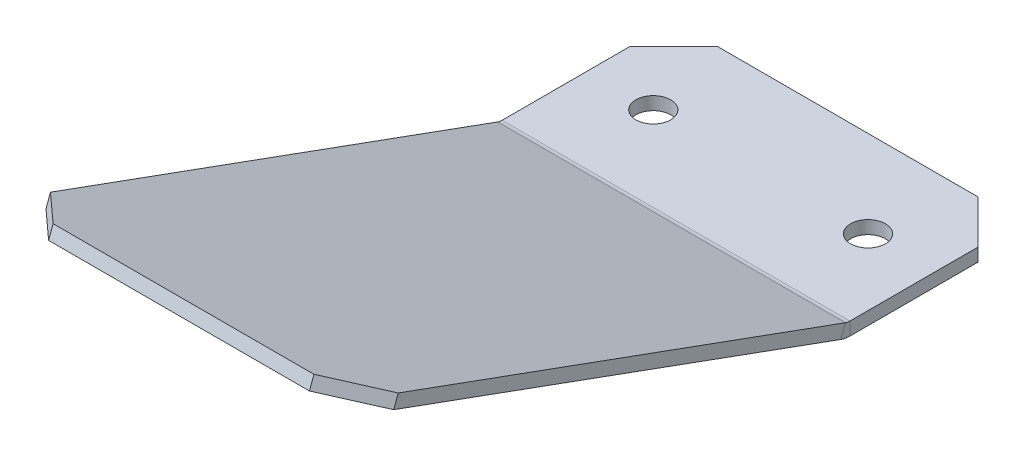
ISO-10303-21;
HEADER;
FILE_DESCRIPTION(('STEP AP214'),'2;1');
FILE_NAME('part.step','',(''),(''),'','','');
FILE_SCHEMA(('AUTOMOTIVE_DESIGN { 1 0 10303 214 1 1 1 1 }'));
ENDSEC;
DATA;
#1=APPLICATION_CONTEXT('core data for automotive mechanical design processes');
#2=APPLICATION_PROTOCOL_DEFINITION('international standard','automotive_design',2000,#1);
#3=PRODUCT_CONTEXT('',#1,'mechanical');
#4=PRODUCT('Part','Part','',(#3));
#5=PRODUCT_RELATED_PRODUCT_CATEGORY('part','',(#4));
#6=PRODUCT_DEFINITION_FORMATION('','',#4);
#7=PRODUCT_DEFINITION_CONTEXT('part definition',#1,'design');
#8=PRODUCT_DEFINITION('design','',#6,#7);
#9=PRODUCT_DEFINITION_SHAPE('','',#8);
#10=(LENGTH_UNIT() NAMED_UNIT(*) SI_UNIT(.MILLI.,.METRE.));
#11=(NAMED_UNIT(*) PLANE_ANGLE_UNIT() SI_UNIT($,.RADIAN.));
#12=(NAMED_UNIT(*) SI_UNIT($,.STERADIAN.) SOLID_ANGLE_UNIT());
#13=UNCERTAINTY_MEASURE_WITH_UNIT(LENGTH_MEASURE(1.E-05),#10,'distance_accuracy_value','');
#14=(GEOMETRIC_REPRESENTATION_CONTEXT(3) GLOBAL_UNCERTAINTY_ASSIGNED_CONTEXT((#13)) GLOBAL_UNIT_ASSIGNED_CONTEXT((#10,
#11,#12)) REPRESENTATION_CONTEXT('',''));
#15=CARTESIAN_POINT('',(0.,0.,0.));
#16=DIRECTION('',(0.,0.,1.));
#17=DIRECTION('',(1.,0.,0.));
#18=AXIS2_PLACEMENT_3D('',#15,#16,#17);
#19=CARTESIAN_POINT('',(20.,-1.5,-10.));
#20=DIRECTION('',(1.,0.,0.));
#21=DIRECTION('',(0.,0.,-1.));
#22=AXIS2_PLACEMENT_3D('',#19,#20,#21);
#23=PLANE('',#22);
#24=DIRECTION('',(0.,0.,-1.));
#25=VECTOR('',#24,1.);
#26=CARTESIAN_POINT('',(20.,-1.5,-10.));
#27=LINE('',#26,#25);
#28=CARTESIAN_POINT('',(20.,-1.5,9.73550952893731));
#29=VERTEX_POINT('',#28);
#30=CARTESIAN_POINT('',(20.,-1.5,-5.));
#31=VERTEX_POINT('',#30);
#32=EDGE_CURVE('E207',#29,#31,#27,.T.);
#33=ORIENTED_EDGE('',*,*,#32,.T.);
#34=DIRECTION('',(0.,1.,0.));
#35=VECTOR('',#34,1.);
#36=CARTESIAN_POINT('',(20.,-1.5,-4.99999999999999));
#37=LINE('',#36,#35);
#38=CARTESIAN_POINT('',(20.,0.,-5.));
#39=VERTEX_POINT('',#38);
#40=EDGE_CURVE('E238',#31,#39,#37,.T.);
#41=ORIENTED_EDGE('',*,*,#40,.T.);
#42=DIRECTION('',(0.,0.,-1.));
#43=VECTOR('',#42,1.);
#44=CARTESIAN_POINT('',(20.,0.,-10.));
#45=LINE('',#44,#43);
#46=CARTESIAN_POINT('',(20.,0.,9.73550952893731));
#47=VERTEX_POINT('',#46);
#48=EDGE_CURVE('E206',#47,#39,#45,.T.);
#49=ORIENTED_EDGE('',*,*,#48,.F.);
#50=DIRECTION('',(0.,-1.,0.));
#51=VECTOR('',#50,1.);
#52=CARTESIAN_POINT('',(20.,0.,9.73550952893731));
#53=LINE('',#52,#51);
#54=EDGE_CURVE('E181',#47,#29,#53,.T.);
#55=ORIENTED_EDGE('',*,*,#54,.T.);
#56=EDGE_LOOP('',(#33,#41,#49,#55));
#57=FACE_BOUND('',#56,.T.);
#58=ADVANCED_FACE('F39',(#57),#23,.T.);
#59=CARTESIAN_POINT('',(0.,-1.5,0.));
#60=DIRECTION('',(0.,1.,0.));
#61=DIRECTION('',(0.,0.,1.));
#62=AXIS2_PLACEMENT_3D('',#59,#60,#61);
#63=PLANE('',#62);
#64=CARTESIAN_POINT('',(-12.3492795753286,-1.5,0.));
#65=DIRECTION('',(0.,1.,0.));
#66=DIRECTION('',(0.,0.,1.));
#67=AXIS2_PLACEMENT_3D('',#64,#65,#66);
#68=CIRCLE('',#67,2.);
#69=CARTESIAN_POINT('',(-12.3492795753286,-1.5,2.));
#70=VERTEX_POINT('',#69);
#71=EDGE_CURVE('E203',#70,#70,#68,.T.);
#72=ORIENTED_EDGE('',*,*,#71,.T.);
#73=EDGE_LOOP('',(#72));
#74=FACE_BOUND('',#73,.T.);
#75=CARTESIAN_POINT('',(12.3492795753286,-1.5,0.));
#76=DIRECTION('',(0.,1.,0.));
#77=DIRECTION('',(0.,0.,1.));
#78=AXIS2_PLACEMENT_3D('',#75,#76,#77);
#79=CIRCLE('',#78,2.);
#80=CARTESIAN_POINT('',(12.3492795753286,-1.5,2.00000000000001));
#81=VERTEX_POINT('',#80);
#82=EDGE_CURVE('E197',#81,#81,#79,.T.);
#83=ORIENTED_EDGE('',*,*,#82,.T.);
#84=EDGE_LOOP('',(#83));
#85=FACE_BOUND('',#84,.T.);
#86=DIRECTION('',(-1.,0.,0.));
#87=VECTOR('',#86,1.);
#88=CARTESIAN_POINT('',(-20.,-1.5,-10.));
#89=LINE('',#88,#87);
#90=CARTESIAN_POINT('',(15.,-1.5,-10.));
#91=VERTEX_POINT('',#90);
#92=CARTESIAN_POINT('',(-15.,-1.5,-10.));
#93=VERTEX_POINT('',#92);
#94=EDGE_CURVE('E210',#91,#93,#89,.T.);
#95=ORIENTED_EDGE('',*,*,#94,.F.);
#96=DIRECTION('',(-0.707106781186549,0.,-0.707106781186547));
#97=VECTOR('',#96,1.);
#98=CARTESIAN_POINT('',(20.,-1.5,-4.99999999999999));
#99=LINE('',#98,#97);
#100=EDGE_CURVE('E47',#91,#31,#99,.F.);
#101=ORIENTED_EDGE('',*,*,#100,.T.);
#102=ORIENTED_EDGE('',*,*,#32,.F.);
#103=DIRECTION('',(1.,0.,0.));
#104=VECTOR('',#103,1.);
#105=CARTESIAN_POINT('',(20.,-1.5,9.73550952893731));
#106=LINE('',#105,#104);
#107=CARTESIAN_POINT('',(-20.,-1.5,9.73550952893731));
#108=VERTEX_POINT('',#107);
#109=EDGE_CURVE('E137',#29,#108,#106,.F.);
#110=ORIENTED_EDGE('',*,*,#109,.T.);
#111=DIRECTION('',(0.,0.,1.));
#112=VECTOR('',#111,1.);
#113=CARTESIAN_POINT('',(-20.,-1.5,-10.));
#114=LINE('',#113,#112);
#115=CARTESIAN_POINT('',(-20.,-1.5,-4.99999999999998));
#116=VERTEX_POINT('',#115);
#117=EDGE_CURVE('E213',#116,#108,#114,.T.);
#118=ORIENTED_EDGE('',*,*,#117,.F.);
#119=DIRECTION('',(-0.707106781186547,0.,0.707106781186548));
#120=VECTOR('',#119,1.);
#121=CARTESIAN_POINT('',(-15.,-1.5,-10.));
#122=LINE('',#121,#120);
#123=EDGE_CURVE('E59',#116,#93,#122,.F.);
#124=ORIENTED_EDGE('',*,*,#123,.T.);
#125=EDGE_LOOP('',(#95,#101,#102,#110,#118,#124));
#126=FACE_BOUND('',#125,.T.);
#127=ADVANCED_FACE('F251',(#74,#85,#126),#63,.F.);
#128=CARTESIAN_POINT('',(0.,0.,0.));
#129=DIRECTION('',(0.,1.,0.));
#130=DIRECTION('',(0.,0.,1.));
#131=AXIS2_PLACEMENT_3D('',#128,#129,#130);
#132=PLANE('',#131);
#133=CARTESIAN_POINT('',(-12.3492795753286,0.,0.));
#134=DIRECTION('',(0.,1.,0.));
#135=DIRECTION('',(0.,0.,1.));
#136=AXIS2_PLACEMENT_3D('',#133,#134,#135);
#137=CIRCLE('',#136,2.);
#138=CARTESIAN_POINT('',(-12.3492795753286,0.,2.));
#139=VERTEX_POINT('',#138);
#140=EDGE_CURVE('E200',#139,#139,#137,.T.);
#141=ORIENTED_EDGE('',*,*,#140,.F.);
#142=EDGE_LOOP('',(#141));
#143=FACE_BOUND('',#142,.T.);
#144=CARTESIAN_POINT('',(12.3492795753286,0.,0.));
#145=DIRECTION('',(0.,1.,0.));
#146=DIRECTION('',(0.,0.,-1.));
#147=AXIS2_PLACEMENT_3D('',#144,#145,#146);
#148=CIRCLE('',#147,2.);
#149=CARTESIAN_POINT('',(12.3492795753286,0.,-1.99999999999999));
#150=VERTEX_POINT('',#149);
#151=EDGE_CURVE('E192',#150,#150,#148,.T.);
#152=ORIENTED_EDGE('',*,*,#151,.F.);
#153=EDGE_LOOP('',(#152));
#154=FACE_BOUND('',#153,.T.);
#155=ORIENTED_EDGE('',*,*,#48,.T.);
#156=DIRECTION('',(0.707106781186549,0.,0.707106781186547));
#157=VECTOR('',#156,1.);
#158=CARTESIAN_POINT('',(12.5,0.,-12.5));
#159=LINE('',#158,#157);
#160=CARTESIAN_POINT('',(15.,0.,-10.));
#161=VERTEX_POINT('',#160);
#162=EDGE_CURVE('E243',#39,#161,#159,.F.);
#163=ORIENTED_EDGE('',*,*,#162,.T.);
#164=DIRECTION('',(-1.,0.,0.));
#165=VECTOR('',#164,1.);
#166=CARTESIAN_POINT('',(-20.,0.,-10.));
#167=LINE('',#166,#165);
#168=CARTESIAN_POINT('',(-15.,0.,-10.));
#169=VERTEX_POINT('',#168);
#170=EDGE_CURVE('E218',#161,#169,#167,.T.);
#171=ORIENTED_EDGE('',*,*,#170,.T.);
#172=DIRECTION('',(0.707106781186547,0.,-0.707106781186548));
#173=VECTOR('',#172,1.);
#174=CARTESIAN_POINT('',(-12.5,0.,-12.5));
#175=LINE('',#174,#173);
#176=CARTESIAN_POINT('',(-20.,0.,-4.99999999999998));
#177=VERTEX_POINT('',#176);
#178=EDGE_CURVE('E241',#169,#177,#175,.F.);
#179=ORIENTED_EDGE('',*,*,#178,.T.);
#180=DIRECTION('',(0.,0.,1.));
#181=VECTOR('',#180,1.);
#182=CARTESIAN_POINT('',(-20.,0.,-10.));
#183=LINE('',#182,#181);
#184=CARTESIAN_POINT('',(-20.,0.,9.73550952893731));
#185=VERTEX_POINT('',#184);
#186=EDGE_CURVE('E211',#177,#185,#183,.T.);
#187=ORIENTED_EDGE('',*,*,#186,.T.);
#188=DIRECTION('',(1.,0.,0.));
#189=VECTOR('',#188,1.);
#190=CARTESIAN_POINT('',(20.,0.,9.73550952893731));
#191=LINE('',#190,#189);
#192=EDGE_CURVE('E185',#47,#185,#191,.F.);
#193=ORIENTED_EDGE('',*,*,#192,.F.);
#194=EDGE_LOOP('',(#155,#163,#171,#179,#187,#193));
#195=FACE_BOUND('',#194,.T.);
#196=ADVANCED_FACE('F260',(#143,#154,#195),#132,.T.);
#197=CARTESIAN_POINT('',(-20.,-1.5,-10.));
#198=DIRECTION('',(-1.,0.,0.));
#199=DIRECTION('',(0.,0.,1.));
#200=AXIS2_PLACEMENT_3D('',#197,#198,#199);
#201=PLANE('',#200);
#202=ORIENTED_EDGE('',*,*,#186,.F.);
#203=DIRECTION('',(0.,-1.,0.));
#204=VECTOR('',#203,1.);
#205=CARTESIAN_POINT('',(-20.,-1.5,-4.99999999999998));
#206=LINE('',#205,#204);
#207=EDGE_CURVE('E11',#177,#116,#206,.T.);
#208=ORIENTED_EDGE('',*,*,#207,.T.);
#209=ORIENTED_EDGE('',*,*,#117,.T.);
#210=DIRECTION('',(0.,-1.,0.));
#211=VECTOR('',#210,1.);
#212=CARTESIAN_POINT('',(-20.,0.,9.73550952893731));
#213=LINE('',#212,#211);
#214=EDGE_CURVE('E189',#185,#108,#213,.T.);
#215=ORIENTED_EDGE('',*,*,#214,.F.);
#216=EDGE_LOOP('',(#202,#208,#209,#215));
#217=FACE_BOUND('',#216,.T.);
#218=ADVANCED_FACE('F266',(#217),#201,.T.);
#219=CARTESIAN_POINT('',(-20.,-1.5,-10.));
#220=DIRECTION('',(0.,0.,-1.));
#221=DIRECTION('',(-1.,0.,0.));
#222=AXIS2_PLACEMENT_3D('',#219,#220,#221);
#223=PLANE('',#222);
#224=ORIENTED_EDGE('',*,*,#170,.F.);
#225=DIRECTION('',(0.,-1.,0.));
#226=VECTOR('',#225,1.);
#227=CARTESIAN_POINT('',(15.,-1.5,-10.));
#228=LINE('',#227,#226);
#229=EDGE_CURVE('E248',#161,#91,#228,.T.);
#230=ORIENTED_EDGE('',*,*,#229,.T.);
#231=ORIENTED_EDGE('',*,*,#94,.T.);
#232=DIRECTION('',(0.,1.,0.));
#233=VECTOR('',#232,1.);
#234=CARTESIAN_POINT('',(-15.,-1.5,-10.));
#235=LINE('',#234,#233);
#236=EDGE_CURVE('E245',#93,#169,#235,.T.);
#237=ORIENTED_EDGE('',*,*,#236,.T.);
#238=EDGE_LOOP('',(#224,#230,#231,#237));
#239=FACE_BOUND('',#238,.T.);
#240=ADVANCED_FACE('F262',(#239),#223,.T.);
#241=CARTESIAN_POINT('',(-12.3492795753286,-10.,0.));
#242=DIRECTION('',(0.,1.,0.));
#243=DIRECTION('',(0.,0.,1.));
#244=AXIS2_PLACEMENT_3D('',#241,#242,#243);
#245=CYLINDRICAL_SURFACE('',#244,2.);
#246=ORIENTED_EDGE('',*,*,#140,.T.);
#247=EDGE_LOOP('',(#246));
#248=FACE_BOUND('',#247,.T.);
#249=ORIENTED_EDGE('',*,*,#71,.F.);
#250=EDGE_LOOP('',(#249));
#251=FACE_BOUND('',#250,.T.);
#252=ADVANCED_FACE('F385',(#248,#251),#245,.F.);
#253=CARTESIAN_POINT('',(12.3492795753286,-10.,0.));
#254=DIRECTION('',(0.,1.,0.));
#255=DIRECTION('',(0.,0.,1.));
#256=AXIS2_PLACEMENT_3D('',#253,#254,#255);
#257=CYLINDRICAL_SURFACE('',#256,2.);
#258=ORIENTED_EDGE('',*,*,#151,.T.);
#259=EDGE_LOOP('',(#258));
#260=FACE_BOUND('',#259,.T.);
#261=ORIENTED_EDGE('',*,*,#82,.F.);
#262=EDGE_LOOP('',(#261));
#263=FACE_BOUND('',#262,.T.);
#264=ADVANCED_FACE('F450',(#260,#263),#257,.F.);
#265=CARTESIAN_POINT('',(-20.,1.5,9.73550952893731));
#266=DIRECTION('',(-1.,0.,0.));
#267=DIRECTION('',(0.,0.,1.));
#268=AXIS2_PLACEMENT_3D('',#265,#266,#267);
#269=PLANE('',#268);
#270=DIRECTION('',(0.,-0.93969262078591,0.342020143325663));
#271=VECTOR('',#270,1.);
#272=CARTESIAN_POINT('',(-20.,0.0904610688211346,10.2485397439258));
#273=LINE('',#272,#271);
#274=CARTESIAN_POINT('',(-20.,0.0904610688211339,10.2485397439258));
#275=VERTEX_POINT('',#274);
#276=CARTESIAN_POINT('',(-20.,-1.31907786235773,10.7615699589143));
#277=VERTEX_POINT('',#276);
#278=EDGE_CURVE('E275',#275,#277,#273,.T.);
#279=ORIENTED_EDGE('',*,*,#278,.F.);
#280=CARTESIAN_POINT('',(-20.,1.5,9.73550952893731));
#281=DIRECTION('',(1.,0.,0.));
#282=DIRECTION('',(0.,0.,-1.));
#283=AXIS2_PLACEMENT_3D('',#280,#281,#282);
#284=CIRCLE('',#283,1.5);
#285=EDGE_CURVE('E140',#185,#275,#284,.F.);
#286=ORIENTED_EDGE('',*,*,#285,.F.);
#287=ORIENTED_EDGE('',*,*,#214,.T.);
#288=CARTESIAN_POINT('',(-20.,1.5,9.73550952893731));
#289=DIRECTION('',(1.,0.,0.));
#290=DIRECTION('',(0.,0.,-1.));
#291=AXIS2_PLACEMENT_3D('',#288,#289,#290);
#292=CIRCLE('',#291,3.);
#293=EDGE_CURVE('E180',#108,#277,#292,.F.);
#294=ORIENTED_EDGE('',*,*,#293,.T.);
#295=EDGE_LOOP('',(#279,#286,#287,#294));
#296=FACE_BOUND('',#295,.T.);
#297=ADVANCED_FACE('F273',(#296),#269,.T.);
#298=CARTESIAN_POINT('',(20.,1.5,9.73550952893731));
#299=DIRECTION('',(-1.,0.,0.));
#300=DIRECTION('',(0.,0.,1.));
#301=AXIS2_PLACEMENT_3D('',#298,#299,#300);
#302=PLANE('',#301);
#303=CARTESIAN_POINT('',(20.,1.5,9.73550952893731));
#304=DIRECTION('',(1.,0.,0.));
#305=DIRECTION('',(0.,0.,-1.));
#306=AXIS2_PLACEMENT_3D('',#303,#304,#305);
#307=CIRCLE('',#306,1.5);
#308=CARTESIAN_POINT('',(20.,0.0904610688211339,10.2485397439258));
#309=VERTEX_POINT('',#308);
#310=EDGE_CURVE('E147',#309,#47,#307,.T.);
#311=ORIENTED_EDGE('',*,*,#310,.F.);
#312=DIRECTION('',(0.,-0.93969262078591,0.342020143325663));
#313=VECTOR('',#312,1.);
#314=CARTESIAN_POINT('',(20.,0.0904610688211346,10.2485397439258));
#315=LINE('',#314,#313);
#316=CARTESIAN_POINT('',(20.,-1.31907786235773,10.7615699589143));
#317=VERTEX_POINT('',#316);
#318=EDGE_CURVE('E144',#309,#317,#315,.T.);
#319=ORIENTED_EDGE('',*,*,#318,.T.);
#320=CARTESIAN_POINT('',(20.,1.5,9.73550952893731));
#321=DIRECTION('',(1.,0.,0.));
#322=DIRECTION('',(0.,0.,-1.));
#323=AXIS2_PLACEMENT_3D('',#320,#321,#322);
#324=CIRCLE('',#323,3.);
#325=EDGE_CURVE('E129',#317,#29,#324,.T.);
#326=ORIENTED_EDGE('',*,*,#325,.T.);
#327=ORIENTED_EDGE('',*,*,#54,.F.);
#328=EDGE_LOOP('',(#311,#319,#326,#327));
#329=FACE_BOUND('',#328,.T.);
#330=ADVANCED_FACE('F145',(#329),#302,.F.);
#331=CARTESIAN_POINT('',(20.,1.5,9.73550952893731));
#332=DIRECTION('',(1.,0.,0.));
#333=DIRECTION('',(0.,-0.939692620785911,0.342020143325663));
#334=AXIS2_PLACEMENT_3D('',#331,#332,#333);
#335=CYLINDRICAL_SURFACE('',#334,3.);
#336=ORIENTED_EDGE('',*,*,#109,.F.);
#337=ORIENTED_EDGE('',*,*,#325,.F.);
#338=DIRECTION('',(-1.,0.,0.));
#339=VECTOR('',#338,1.);
#340=CARTESIAN_POINT('',(0.,-1.31907786235773,10.7615699589143));
#341=LINE('',#340,#339);
#342=EDGE_CURVE('E134',#317,#277,#341,.T.);
#343=ORIENTED_EDGE('',*,*,#342,.T.);
#344=ORIENTED_EDGE('',*,*,#293,.F.);
#345=EDGE_LOOP('',(#336,#337,#343,#344));
#346=FACE_BOUND('',#345,.T.);
#347=ADVANCED_FACE('F131',(#346),#335,.T.);
#348=CARTESIAN_POINT('',(20.,1.5,9.73550952893731));
#349=DIRECTION('',(1.,0.,0.));
#350=DIRECTION('',(0.,-0.939692620785911,0.342020143325663));
#351=AXIS2_PLACEMENT_3D('',#348,#349,#350);
#352=CYLINDRICAL_SURFACE('',#351,1.5);
#353=ORIENTED_EDGE('',*,*,#192,.T.);
#354=ORIENTED_EDGE('',*,*,#285,.T.);
#355=DIRECTION('',(1.,0.,0.));
#356=VECTOR('',#355,1.);
#357=CARTESIAN_POINT('',(-20.,0.0904610688211346,10.2485397439258));
#358=LINE('',#357,#356);
#359=EDGE_CURVE('E152',#275,#309,#358,.T.);
#360=ORIENTED_EDGE('',*,*,#359,.T.);
#361=ORIENTED_EDGE('',*,*,#310,.T.);
#362=EDGE_LOOP('',(#353,#354,#360,#361));
#363=FACE_BOUND('',#362,.T.);
#364=ADVANCED_FACE('F270',(#363),#352,.F.);
#365=CARTESIAN_POINT('',(20.,19.1116696683609,66.8945874621431));
#366=DIRECTION('',(-1.,0.,0.));
#367=DIRECTION('',(0.,0.,1.));
#368=AXIS2_PLACEMENT_3D('',#365,#366,#367);
#369=PLANE('',#368);
#370=DIRECTION('',(0.,0.342020143325663,0.93969262078591));
#371=VECTOR('',#370,1.);
#372=CARTESIAN_POINT('',(20.,20.5212085995398,66.3815572471546));
#373=LINE('',#372,#371);
#374=CARTESIAN_POINT('',(20.,18.8111078829115,61.683094143225));
#375=VERTEX_POINT('',#374);
#376=EDGE_CURVE('E161',#309,#375,#373,.T.);
#377=ORIENTED_EDGE('',*,*,#376,.T.);
#378=DIRECTION('',(0.,-0.939692620785911,0.342020143325663));
#379=VECTOR('',#378,1.);
#380=CARTESIAN_POINT('',(20.,17.4015689517326,62.1961243582135));
#381=LINE('',#380,#379);
#382=CARTESIAN_POINT('',(20.,17.4015689517326,62.1961243582135));
#383=VERTEX_POINT('',#382);
#384=EDGE_CURVE('E165',#375,#383,#381,.T.);
#385=ORIENTED_EDGE('',*,*,#384,.T.);
#386=DIRECTION('',(0.,0.342020143325663,0.93969262078591));
#387=VECTOR('',#386,1.);
#388=CARTESIAN_POINT('',(20.,19.1116696683609,66.8945874621431));
#389=LINE('',#388,#387);
#390=EDGE_CURVE('E157',#317,#383,#389,.T.);
#391=ORIENTED_EDGE('',*,*,#390,.F.);
#392=ORIENTED_EDGE('',*,*,#318,.F.);
#393=EDGE_LOOP('',(#377,#385,#391,#392));
#394=FACE_BOUND('',#393,.T.);
#395=ADVANCED_FACE('F163',(#394),#369,.F.);
#396=CARTESIAN_POINT('',(-20.,-1.40953893117887,10.5130302149885));
#397=DIRECTION('',(1.,0.,0.));
#398=DIRECTION('',(0.,0.,-1.));
#399=AXIS2_PLACEMENT_3D('',#396,#397,#398);
#400=PLANE('',#399);
#401=DIRECTION('',(0.,-0.342020143325663,-0.93969262078591));
#402=VECTOR('',#401,1.);
#403=CARTESIAN_POINT('',(-20.,-1.40953893117887,10.5130302149885));
#404=LINE('',#403,#402);
#405=CARTESIAN_POINT('',(-20.,17.4015689517326,62.1961243582135));
#406=VERTEX_POINT('',#405);
#407=EDGE_CURVE('E160',#406,#277,#404,.T.);
#408=ORIENTED_EDGE('',*,*,#407,.F.);
#409=DIRECTION('',(0.,0.939692620785911,-0.342020143325663));
#410=VECTOR('',#409,1.);
#411=CARTESIAN_POINT('',(-20.,17.4015689517326,62.1961243582135));
#412=LINE('',#411,#410);
#413=CARTESIAN_POINT('',(-20.,18.8111078829115,61.683094143225));
#414=VERTEX_POINT('',#413);
#415=EDGE_CURVE('E235',#406,#414,#412,.T.);
#416=ORIENTED_EDGE('',*,*,#415,.T.);
#417=DIRECTION('',(0.,-0.342020143325663,-0.93969262078591));
#418=VECTOR('',#417,1.);
#419=CARTESIAN_POINT('',(-20.,0.,10.));
#420=LINE('',#419,#418);
#421=EDGE_CURVE('E167',#414,#275,#420,.T.);
#422=ORIENTED_EDGE('',*,*,#421,.T.);
#423=ORIENTED_EDGE('',*,*,#278,.T.);
#424=EDGE_LOOP('',(#408,#416,#422,#423));
#425=FACE_BOUND('',#424,.T.);
#426=ADVANCED_FACE('F293',(#425),#400,.F.);
#427=CARTESIAN_POINT('',(0.,-4.62347697961152,1.68280799939357));
#428=DIRECTION('',(0.,0.939692620785911,-0.342020143325663));
#429=DIRECTION('',(0.,0.342020143325663,0.939692620785911));
#430=AXIS2_PLACEMENT_3D('',#427,#428,#429);
#431=PLANE('',#430);
#432=ORIENTED_EDGE('',*,*,#390,.T.);
#433=DIRECTION('',(0.707106781186545,-0.241844762647972,-0.664463024388678));
#434=VECTOR('',#433,1.);
#435=CARTESIAN_POINT('',(15.,19.1116696683609,66.8945874621431));
#436=LINE('',#435,#434);
#437=CARTESIAN_POINT('',(15.,19.1116696683609,66.8945874621431));
#438=VERTEX_POINT('',#437);
#439=EDGE_CURVE('E233',#383,#438,#436,.F.);
#440=ORIENTED_EDGE('',*,*,#439,.T.);
#441=DIRECTION('',(-1.,0.,0.));
#442=VECTOR('',#441,1.);
#443=CARTESIAN_POINT('',(-20.,19.1116696683609,66.8945874621431));
#444=LINE('',#443,#442);
#445=CARTESIAN_POINT('',(-15.,19.1116696683609,66.8945874621431));
#446=VERTEX_POINT('',#445);
#447=EDGE_CURVE('E166',#438,#446,#444,.T.);
#448=ORIENTED_EDGE('',*,*,#447,.T.);
#449=DIRECTION('',(0.707106781186548,0.241844762647971,0.664463024388676));
#450=VECTOR('',#449,1.);
#451=CARTESIAN_POINT('',(-20.,17.4015689517326,62.1961243582135));
#452=LINE('',#451,#450);
#453=EDGE_CURVE('E231',#446,#406,#452,.F.);
#454=ORIENTED_EDGE('',*,*,#453,.T.);
#455=ORIENTED_EDGE('',*,*,#407,.T.);
#456=ORIENTED_EDGE('',*,*,#342,.F.);
#457=EDGE_LOOP('',(#432,#440,#448,#454,#455,#456));
#458=FACE_BOUND('',#457,.T.);
#459=ADVANCED_FACE('F156',(#458),#431,.F.);
#460=CARTESIAN_POINT('',(0.,-3.21393804843265,1.16977778440507));
#461=DIRECTION('',(0.,0.939692620785911,-0.342020143325663));
#462=DIRECTION('',(0.,0.342020143325663,0.939692620785911));
#463=AXIS2_PLACEMENT_3D('',#460,#461,#462);
#464=PLANE('',#463);
#465=DIRECTION('',(-1.,0.,0.));
#466=VECTOR('',#465,1.);
#467=CARTESIAN_POINT('',(-20.,20.5212085995398,66.3815572471546));
#468=LINE('',#467,#466);
#469=CARTESIAN_POINT('',(15.,20.5212085995398,66.3815572471546));
#470=VERTEX_POINT('',#469);
#471=CARTESIAN_POINT('',(-15.,20.5212085995398,66.3815572471546));
#472=VERTEX_POINT('',#471);
#473=EDGE_CURVE('E171',#470,#472,#468,.T.);
#474=ORIENTED_EDGE('',*,*,#473,.F.);
#475=DIRECTION('',(-0.707106781186545,0.241844762647972,0.664463024388678));
#476=VECTOR('',#475,1.);
#477=CARTESIAN_POINT('',(42.1984631039296,11.218786350496,40.823362171674));
#478=LINE('',#477,#476);
#479=EDGE_CURVE('E228',#470,#375,#478,.F.);
#480=ORIENTED_EDGE('',*,*,#479,.T.);
#481=ORIENTED_EDGE('',*,*,#376,.F.);
#482=ORIENTED_EDGE('',*,*,#359,.F.);
#483=ORIENTED_EDGE('',*,*,#421,.F.);
#484=DIRECTION('',(-0.707106781186548,-0.241844762647971,-0.664463024388676));
#485=VECTOR('',#484,1.);
#486=CARTESIAN_POINT('',(-42.1984631039295,11.218786350496,40.8233621716742));
#487=LINE('',#486,#485);
#488=EDGE_CURVE('E226',#414,#472,#487,.F.);
#489=ORIENTED_EDGE('',*,*,#488,.T.);
#490=EDGE_LOOP('',(#474,#480,#481,#482,#483,#489));
#491=FACE_BOUND('',#490,.T.);
#492=ADVANCED_FACE('F281',(#491),#464,.T.);
#493=CARTESIAN_POINT('',(-20.,19.1116696683609,66.8945874621431));
#494=DIRECTION('',(0.,-0.342020143325663,-0.93969262078591));
#495=DIRECTION('',(0.,0.939692620785911,-0.342020143325663));
#496=AXIS2_PLACEMENT_3D('',#493,#494,#495);
#497=PLANE('',#496);
#498=ORIENTED_EDGE('',*,*,#447,.F.);
#499=DIRECTION('',(0.,0.939692620785911,-0.342020143325663));
#500=VECTOR('',#499,1.);
#501=CARTESIAN_POINT('',(15.,19.1116696683609,66.8945874621431));
#502=LINE('',#501,#500);
#503=EDGE_CURVE('E223',#438,#470,#502,.T.);
#504=ORIENTED_EDGE('',*,*,#503,.T.);
#505=ORIENTED_EDGE('',*,*,#473,.T.);
#506=DIRECTION('',(0.,-0.939692620785911,0.342020143325663));
#507=VECTOR('',#506,1.);
#508=CARTESIAN_POINT('',(-15.,19.1116696683609,66.8945874621431));
#509=LINE('',#508,#507);
#510=EDGE_CURVE('E215',#472,#446,#509,.T.);
#511=ORIENTED_EDGE('',*,*,#510,.T.);
#512=EDGE_LOOP('',(#498,#504,#505,#511));
#513=FACE_BOUND('',#512,.T.);
#514=ADVANCED_FACE('F288',(#513),#497,.F.);
#515=CARTESIAN_POINT('',(15.,19.1116696683609,66.8945874621431));
#516=DIRECTION('',(-0.70710678118655,-0.24184476264797,-0.664463024388674));
#517=DIRECTION('',(0.,0.939692620785911,-0.342020143325663));
#518=AXIS2_PLACEMENT_3D('',#515,#516,#517);
#519=PLANE('',#518);
#520=ORIENTED_EDGE('',*,*,#439,.F.);
#521=ORIENTED_EDGE('',*,*,#384,.F.);
#522=ORIENTED_EDGE('',*,*,#479,.F.);
#523=ORIENTED_EDGE('',*,*,#503,.F.);
#524=EDGE_LOOP('',(#520,#521,#522,#523));
#525=FACE_BOUND('',#524,.T.);
#526=ADVANCED_FACE('F283',(#525),#519,.F.);
#527=CARTESIAN_POINT('',(-20.,17.4015689517326,62.1961243582135));
#528=DIRECTION('',(0.707106781186547,-0.241844762647971,-0.664463024388677));
#529=DIRECTION('',(0.,0.939692620785911,-0.342020143325663));
#530=AXIS2_PLACEMENT_3D('',#527,#528,#529);
#531=PLANE('',#530);
#532=ORIENTED_EDGE('',*,*,#453,.F.);
#533=ORIENTED_EDGE('',*,*,#510,.F.);
#534=ORIENTED_EDGE('',*,*,#488,.F.);
#535=ORIENTED_EDGE('',*,*,#415,.F.);
#536=EDGE_LOOP('',(#532,#533,#534,#535));
#537=FACE_BOUND('',#536,.T.);
#538=ADVANCED_FACE('F291',(#537),#531,.F.);
#539=CARTESIAN_POINT('',(20.,-1.5,-4.99999999999999));
#540=DIRECTION('',(-0.707106781186547,0.,0.707106781186549));
#541=DIRECTION('',(0.,1.,0.));
#542=AXIS2_PLACEMENT_3D('',#539,#540,#541);
#543=PLANE('',#542);
#544=ORIENTED_EDGE('',*,*,#100,.F.);
#545=ORIENTED_EDGE('',*,*,#229,.F.);
#546=ORIENTED_EDGE('',*,*,#162,.F.);
#547=ORIENTED_EDGE('',*,*,#40,.F.);
#548=EDGE_LOOP('',(#544,#545,#546,#547));
#549=FACE_BOUND('',#548,.T.);
#550=ADVANCED_FACE('F257',(#549),#543,.F.);
#551=CARTESIAN_POINT('',(-15.,-1.5,-10.));
#552=DIRECTION('',(0.707106781186548,0.,0.707106781186547));
#553=DIRECTION('',(0.,1.,0.));
#554=AXIS2_PLACEMENT_3D('',#551,#552,#553);
#555=PLANE('',#554);
#556=ORIENTED_EDGE('',*,*,#123,.F.);
#557=ORIENTED_EDGE('',*,*,#207,.F.);
#558=ORIENTED_EDGE('',*,*,#178,.F.);
#559=ORIENTED_EDGE('',*,*,#236,.F.);
#560=EDGE_LOOP('',(#556,#557,#558,#559));
#561=FACE_BOUND('',#560,.T.);
#562=ADVANCED_FACE('F41',(#561),#555,.F.);
#563=CLOSED_SHELL('',(#58,#127,#196,#218,#240,#252,#264,#297,#330,#347,#364,#395,#426,#459,#492,
#514,#526,#538,#550,#562));
#564=MANIFOLD_SOLID_BREP('B2',#563);
#565=ADVANCED_BREP_SHAPE_REPRESENTATION('',(#18,#564),#14);
#566=SHAPE_DEFINITION_REPRESENTATION(#9,#565);
ENDSEC;
END-ISO-10303-21;
